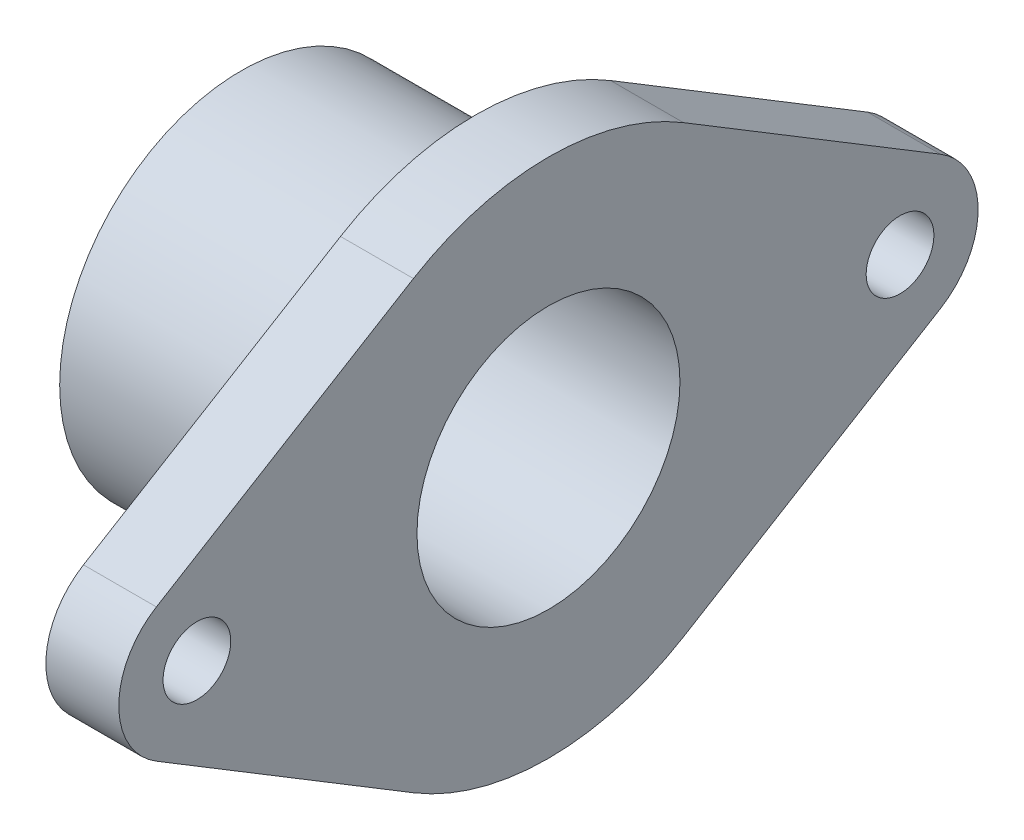
ISO-10303-21;
HEADER;
FILE_DESCRIPTION(('STEP AP214'),'2;1');
FILE_NAME('part.step','',(''),(''),'','','');
FILE_SCHEMA(('AUTOMOTIVE_DESIGN { 1 0 10303 214 1 1 1 1 }'));
ENDSEC;
DATA;
#1=APPLICATION_CONTEXT('core data for automotive mechanical design processes');
#2=APPLICATION_PROTOCOL_DEFINITION('international standard','automotive_design',2000,#1);
#3=PRODUCT_CONTEXT('',#1,'mechanical');
#4=PRODUCT('Part','Part','',(#3));
#5=PRODUCT_RELATED_PRODUCT_CATEGORY('part','',(#4));
#6=PRODUCT_DEFINITION_FORMATION('','',#4);
#7=PRODUCT_DEFINITION_CONTEXT('part definition',#1,'design');
#8=PRODUCT_DEFINITION('design','',#6,#7);
#9=PRODUCT_DEFINITION_SHAPE('','',#8);
#10=(LENGTH_UNIT() NAMED_UNIT(*) SI_UNIT(.MILLI.,.METRE.));
#11=(NAMED_UNIT(*) PLANE_ANGLE_UNIT() SI_UNIT($,.RADIAN.));
#12=(NAMED_UNIT(*) SI_UNIT($,.STERADIAN.) SOLID_ANGLE_UNIT());
#13=UNCERTAINTY_MEASURE_WITH_UNIT(LENGTH_MEASURE(1.E-05),#10,'distance_accuracy_value','');
#14=(GEOMETRIC_REPRESENTATION_CONTEXT(3) GLOBAL_UNCERTAINTY_ASSIGNED_CONTEXT((#13)) GLOBAL_UNIT_ASSIGNED_CONTEXT((#10,
#11,#12)) REPRESENTATION_CONTEXT('',''));
#15=CARTESIAN_POINT('',(0.,0.,0.));
#16=DIRECTION('',(0.,0.,1.));
#17=DIRECTION('',(1.,0.,0.));
#18=AXIS2_PLACEMENT_3D('',#15,#16,#17);
#19=CARTESIAN_POINT('',(0.,0.,0.));
#20=DIRECTION('',(1.,0.,0.));
#21=DIRECTION('',(0.,0.,-0.999999999999998));
#22=AXIS2_PLACEMENT_3D('',#19,#20,#21);
#23=PLANE('',#22);
#24=CARTESIAN_POINT('',(0.,0.,0.));
#25=DIRECTION('',(1.,0.,0.));
#26=DIRECTION('',(0.,0.,-0.999999999999998));
#27=AXIS2_PLACEMENT_3D('',#24,#25,#26);
#28=CIRCLE('',#27,41.85);
#29=CARTESIAN_POINT('',(0.,0.,-41.8499999999999));
#30=VERTEX_POINT('',#29);
#31=EDGE_CURVE('E202',#30,#30,#28,.T.);
#32=ORIENTED_EDGE('',*,*,#31,.T.);
#33=EDGE_LOOP('',(#32));
#34=FACE_BOUND('',#33,.T.);
#35=CARTESIAN_POINT('',(0.,0.,0.));
#36=DIRECTION('',(1.,0.,0.));
#37=DIRECTION('',(0.,0.,-0.999999999999998));
#38=AXIS2_PLACEMENT_3D('',#35,#36,#37);
#39=CIRCLE('',#38,50.);
#40=CARTESIAN_POINT('',(0.,42.7533199282042,-25.9259259259221));
#41=VERTEX_POINT('',#40);
#42=CARTESIAN_POINT('',(0.,42.753319928206,25.9259259259297));
#43=VERTEX_POINT('',#42);
#44=EDGE_CURVE('E131',#41,#43,#39,.T.);
#45=ORIENTED_EDGE('',*,*,#44,.F.);
#46=DIRECTION('',(0.,0.518518518518521,0.855066398564088));
#47=VECTOR('',#46,1.);
#48=CARTESIAN_POINT('',(0.,42.7533199282042,-25.9259259259221));
#49=LINE('',#48,#47);
#50=CARTESIAN_POINT('',(4.44089209850063E-13,12.8259959784613,-75.277777777774));
#51=VERTEX_POINT('',#50);
#52=EDGE_CURVE('E86',#51,#41,#49,.T.);
#53=ORIENTED_EDGE('',*,*,#52,.F.);
#54=CARTESIAN_POINT('',(4.44089209850063E-13,-3.5527136788005E-12,-67.4999999999963));
#55=DIRECTION('',(1.,0.,0.));
#56=DIRECTION('',(0.,0.,-0.999999999999998));
#57=AXIS2_PLACEMENT_3D('',#54,#55,#56);
#58=CIRCLE('',#57,15.);
#59=CARTESIAN_POINT('',(-4.44089209850063E-13,-12.8259959784631,-75.2777777777793));
#60=VERTEX_POINT('',#59);
#61=EDGE_CURVE('E80',#60,#51,#58,.T.);
#62=ORIENTED_EDGE('',*,*,#61,.F.);
#63=DIRECTION('',(0.,0.518518518518519,-0.855066398564086));
#64=VECTOR('',#63,1.);
#65=CARTESIAN_POINT('',(-4.44089209850063E-13,-12.8259959784631,-75.2777777777793));
#66=LINE('',#65,#64);
#67=CARTESIAN_POINT('',(0.,-42.7533199282042,-25.9259259259261));
#68=VERTEX_POINT('',#67);
#69=EDGE_CURVE('E121',#68,#60,#66,.T.);
#70=ORIENTED_EDGE('',*,*,#69,.F.);
#71=CARTESIAN_POINT('',(0.,0.,0.));
#72=DIRECTION('',(1.,0.,0.));
#73=DIRECTION('',(0.,0.,-0.999999999999998));
#74=AXIS2_PLACEMENT_3D('',#71,#72,#73);
#75=CIRCLE('',#74,50.);
#76=CARTESIAN_POINT('',(0.,-42.7533199282042,25.9259259259257));
#77=VERTEX_POINT('',#76);
#78=EDGE_CURVE('E141',#77,#68,#75,.T.);
#79=ORIENTED_EDGE('',*,*,#78,.F.);
#80=DIRECTION('',(0.,-0.518518518518521,-0.855066398564087));
#81=VECTOR('',#80,1.);
#82=CARTESIAN_POINT('',(0.,-12.8259959784578,75.2777777777793));
#83=LINE('',#82,#81);
#84=CARTESIAN_POINT('',(0.,-12.8259959784578,75.2777777777793));
#85=VERTEX_POINT('',#84);
#86=EDGE_CURVE('E139',#85,#77,#83,.T.);
#87=ORIENTED_EDGE('',*,*,#86,.F.);
#88=CARTESIAN_POINT('',(0.,1.77635683940025E-12,67.4999999999999));
#89=DIRECTION('',(1.,0.,0.));
#90=DIRECTION('',(0.,0.,-0.999999999999998));
#91=AXIS2_PLACEMENT_3D('',#88,#89,#90);
#92=CIRCLE('',#91,15.);
#93=CARTESIAN_POINT('',(8.88178419700125E-13,12.8259959784613,75.2777777777829));
#94=VERTEX_POINT('',#93);
#95=EDGE_CURVE('E137',#94,#85,#92,.T.);
#96=ORIENTED_EDGE('',*,*,#95,.F.);
#97=DIRECTION('',(0.,-0.518518518518519,0.855066398564086));
#98=VECTOR('',#97,1.);
#99=CARTESIAN_POINT('',(0.,42.753319928206,25.9259259259297));
#100=LINE('',#99,#98);
#101=EDGE_CURVE('E134',#43,#94,#100,.T.);
#102=ORIENTED_EDGE('',*,*,#101,.F.);
#103=EDGE_LOOP('',(#45,#53,#62,#70,#79,#87,#96,#102));
#104=FACE_BOUND('',#103,.T.);
#105=CARTESIAN_POINT('',(0.,1.77635683940025E-12,67.4999999999999));
#106=DIRECTION('',(-1.,0.,0.));
#107=DIRECTION('',(0.,0.,0.999999999999998));
#108=AXIS2_PLACEMENT_3D('',#105,#106,#107);
#109=CIRCLE('',#108,6.5);
#110=CARTESIAN_POINT('',(0.,1.78474596213007E-12,73.9999999999999));
#111=VERTEX_POINT('',#110);
#112=EDGE_CURVE('E179',#111,#111,#109,.T.);
#113=ORIENTED_EDGE('',*,*,#112,.F.);
#114=EDGE_LOOP('',(#113));
#115=FACE_BOUND('',#114,.T.);
#116=CARTESIAN_POINT('',(4.44089209850063E-13,-3.5527136788005E-12,-67.4999999999963));
#117=DIRECTION('',(-1.,0.,0.));
#118=DIRECTION('',(0.,0.,0.999999999999998));
#119=AXIS2_PLACEMENT_3D('',#116,#117,#118);
#120=CIRCLE('',#119,6.5);
#121=CARTESIAN_POINT('',(4.44122441969167E-13,-3.54432455607068E-12,-60.9999999999963));
#122=VERTEX_POINT('',#121);
#123=EDGE_CURVE('E185',#122,#122,#120,.T.);
#124=ORIENTED_EDGE('',*,*,#123,.F.);
#125=EDGE_LOOP('',(#124));
#126=FACE_BOUND('',#125,.T.);
#127=ADVANCED_FACE('F34',(#34,#104,#115,#126),#23,.F.);
#128=CARTESIAN_POINT('',(14.,0.,0.));
#129=DIRECTION('',(-1.,0.,0.));
#130=DIRECTION('',(0.,0.,0.999999999999998));
#131=AXIS2_PLACEMENT_3D('',#128,#129,#130);
#132=CYLINDRICAL_SURFACE('',#131,50.);
#133=ORIENTED_EDGE('',*,*,#44,.T.);
#134=DIRECTION('',(-1.,0.,0.));
#135=VECTOR('',#134,1.);
#136=CARTESIAN_POINT('',(14.,42.7533199282042,25.9259259259297));
#137=LINE('',#136,#135);
#138=CARTESIAN_POINT('',(14.,42.7533199282042,25.9259259259297));
#139=VERTEX_POINT('',#138);
#140=EDGE_CURVE('E11',#139,#43,#137,.T.);
#141=ORIENTED_EDGE('',*,*,#140,.F.);
#142=CARTESIAN_POINT('',(14.,0.,0.));
#143=DIRECTION('',(1.,0.,0.));
#144=DIRECTION('',(0.,0.,-0.999999999999998));
#145=AXIS2_PLACEMENT_3D('',#142,#143,#144);
#146=CIRCLE('',#145,50.);
#147=CARTESIAN_POINT('',(14.,42.7533199282042,-25.9259259259221));
#148=VERTEX_POINT('',#147);
#149=EDGE_CURVE('E146',#148,#139,#146,.T.);
#150=ORIENTED_EDGE('',*,*,#149,.F.);
#151=DIRECTION('',(-1.,0.,0.));
#152=VECTOR('',#151,1.);
#153=CARTESIAN_POINT('',(14.,42.7533199282042,-25.9259259259221));
#154=LINE('',#153,#152);
#155=EDGE_CURVE('E127',#148,#41,#154,.T.);
#156=ORIENTED_EDGE('',*,*,#155,.T.);
#157=EDGE_LOOP('',(#133,#141,#150,#156));
#158=FACE_BOUND('',#157,.T.);
#159=ADVANCED_FACE('F36',(#158),#132,.T.);
#160=CARTESIAN_POINT('',(14.,42.7533199282042,25.9259259259297));
#161=DIRECTION('',(0.,-0.855066398564092,-0.518518518518519));
#162=DIRECTION('',(0.,0.518518518518519,-0.855066398564086));
#163=AXIS2_PLACEMENT_3D('',#160,#161,#162);
#164=PLANE('',#163);
#165=ORIENTED_EDGE('',*,*,#101,.T.);
#166=DIRECTION('',(-1.,0.,0.));
#167=VECTOR('',#166,1.);
#168=CARTESIAN_POINT('',(14.0000000000009,12.8259959784613,75.2777777777829));
#169=LINE('',#168,#167);
#170=CARTESIAN_POINT('',(14.0000000000009,12.8259959784613,75.2777777777829));
#171=VERTEX_POINT('',#170);
#172=EDGE_CURVE('E43',#171,#94,#169,.T.);
#173=ORIENTED_EDGE('',*,*,#172,.F.);
#174=DIRECTION('',(0.,-0.518518518518519,0.855066398564086));
#175=VECTOR('',#174,1.);
#176=CARTESIAN_POINT('',(14.,42.7533199282042,25.9259259259297));
#177=LINE('',#176,#175);
#178=EDGE_CURVE('E94',#139,#171,#177,.T.);
#179=ORIENTED_EDGE('',*,*,#178,.F.);
#180=ORIENTED_EDGE('',*,*,#140,.T.);
#181=EDGE_LOOP('',(#165,#173,#179,#180));
#182=FACE_BOUND('',#181,.T.);
#183=ADVANCED_FACE('F224',(#182),#164,.F.);
#184=CARTESIAN_POINT('',(14.,1.77635683940025E-12,67.4999999999999));
#185=DIRECTION('',(-1.,0.,0.));
#186=DIRECTION('',(0.,0.,0.999999999999998));
#187=AXIS2_PLACEMENT_3D('',#184,#185,#186);
#188=CYLINDRICAL_SURFACE('',#187,15.);
#189=ORIENTED_EDGE('',*,*,#95,.T.);
#190=DIRECTION('',(-1.,0.,0.));
#191=VECTOR('',#190,1.);
#192=CARTESIAN_POINT('',(14.,-12.8259959784578,75.2777777777793));
#193=LINE('',#192,#191);
#194=CARTESIAN_POINT('',(14.,-12.8259959784578,75.2777777777793));
#195=VERTEX_POINT('',#194);
#196=EDGE_CURVE('E153',#195,#85,#193,.T.);
#197=ORIENTED_EDGE('',*,*,#196,.F.);
#198=CARTESIAN_POINT('',(14.,1.77635683940025E-12,67.4999999999999));
#199=DIRECTION('',(1.,0.,0.));
#200=DIRECTION('',(0.,0.,-0.999999999999998));
#201=AXIS2_PLACEMENT_3D('',#198,#199,#200);
#202=CIRCLE('',#201,15.);
#203=EDGE_CURVE('E161',#171,#195,#202,.T.);
#204=ORIENTED_EDGE('',*,*,#203,.F.);
#205=ORIENTED_EDGE('',*,*,#172,.T.);
#206=EDGE_LOOP('',(#189,#197,#204,#205));
#207=FACE_BOUND('',#206,.T.);
#208=ADVANCED_FACE('F159',(#207),#188,.T.);
#209=CARTESIAN_POINT('',(14.,-12.8259959784578,75.2777777777793));
#210=DIRECTION('',(0.,0.855066398564091,-0.518518518518516));
#211=DIRECTION('',(0.,0.518518518518521,0.855066398564088));
#212=AXIS2_PLACEMENT_3D('',#209,#210,#211);
#213=PLANE('',#212);
#214=ORIENTED_EDGE('',*,*,#86,.T.);
#215=DIRECTION('',(-1.,0.,0.));
#216=VECTOR('',#215,1.);
#217=CARTESIAN_POINT('',(14.,-42.753319928206,25.9259259259257));
#218=LINE('',#217,#216);
#219=CARTESIAN_POINT('',(14.,-42.753319928206,25.9259259259257));
#220=VERTEX_POINT('',#219);
#221=EDGE_CURVE('E150',#220,#77,#218,.T.);
#222=ORIENTED_EDGE('',*,*,#221,.F.);
#223=DIRECTION('',(0.,-0.518518518518521,-0.855066398564087));
#224=VECTOR('',#223,1.);
#225=CARTESIAN_POINT('',(14.,-12.8259959784578,75.2777777777793));
#226=LINE('',#225,#224);
#227=EDGE_CURVE('E173',#195,#220,#226,.T.);
#228=ORIENTED_EDGE('',*,*,#227,.F.);
#229=ORIENTED_EDGE('',*,*,#196,.T.);
#230=EDGE_LOOP('',(#214,#222,#228,#229));
#231=FACE_BOUND('',#230,.T.);
#232=ADVANCED_FACE('F169',(#231),#213,.F.);
#233=CARTESIAN_POINT('',(14.,0.,0.));
#234=DIRECTION('',(-1.,0.,0.));
#235=DIRECTION('',(0.,0.,0.999999999999998));
#236=AXIS2_PLACEMENT_3D('',#233,#234,#235);
#237=CYLINDRICAL_SURFACE('',#236,50.);
#238=ORIENTED_EDGE('',*,*,#78,.T.);
#239=DIRECTION('',(-1.,0.,0.));
#240=VECTOR('',#239,1.);
#241=CARTESIAN_POINT('',(14.,-42.7533199282042,-25.9259259259261));
#242=LINE('',#241,#240);
#243=CARTESIAN_POINT('',(14.,-42.7533199282042,-25.9259259259261));
#244=VERTEX_POINT('',#243);
#245=EDGE_CURVE('E122',#244,#68,#242,.T.);
#246=ORIENTED_EDGE('',*,*,#245,.F.);
#247=CARTESIAN_POINT('',(14.,0.,0.));
#248=DIRECTION('',(1.,0.,0.));
#249=DIRECTION('',(0.,0.,-0.999999999999998));
#250=AXIS2_PLACEMENT_3D('',#247,#248,#249);
#251=CIRCLE('',#250,50.);
#252=EDGE_CURVE('E113',#220,#244,#251,.T.);
#253=ORIENTED_EDGE('',*,*,#252,.F.);
#254=ORIENTED_EDGE('',*,*,#221,.T.);
#255=EDGE_LOOP('',(#238,#246,#253,#254));
#256=FACE_BOUND('',#255,.T.);
#257=ADVANCED_FACE('F172',(#256),#237,.T.);
#258=CARTESIAN_POINT('',(13.9999999999996,-12.8259959784613,-75.2777777777793));
#259=DIRECTION('',(0.,0.855066398564092,0.518518518518519));
#260=DIRECTION('',(0.,-0.518518518518519,0.855066398564086));
#261=AXIS2_PLACEMENT_3D('',#258,#259,#260);
#262=PLANE('',#261);
#263=ORIENTED_EDGE('',*,*,#69,.T.);
#264=DIRECTION('',(-1.,0.,0.));
#265=VECTOR('',#264,1.);
#266=CARTESIAN_POINT('',(13.9999999999996,-12.8259959784613,-75.2777777777793));
#267=LINE('',#266,#265);
#268=CARTESIAN_POINT('',(13.9999999999996,-12.8259959784613,-75.2777777777793));
#269=VERTEX_POINT('',#268);
#270=EDGE_CURVE('E118',#269,#60,#267,.T.);
#271=ORIENTED_EDGE('',*,*,#270,.F.);
#272=DIRECTION('',(0.,0.518518518518519,-0.855066398564086));
#273=VECTOR('',#272,1.);
#274=CARTESIAN_POINT('',(13.9999999999996,-12.8259959784613,-75.2777777777793));
#275=LINE('',#274,#273);
#276=EDGE_CURVE('E107',#244,#269,#275,.T.);
#277=ORIENTED_EDGE('',*,*,#276,.F.);
#278=ORIENTED_EDGE('',*,*,#245,.T.);
#279=EDGE_LOOP('',(#263,#271,#277,#278));
#280=FACE_BOUND('',#279,.T.);
#281=ADVANCED_FACE('F119',(#280),#262,.F.);
#282=CARTESIAN_POINT('',(14.0000000000005,0.,-67.4999999999963));
#283=DIRECTION('',(-1.,0.,0.));
#284=DIRECTION('',(0.,0.,0.999999999999998));
#285=AXIS2_PLACEMENT_3D('',#282,#283,#284);
#286=CYLINDRICAL_SURFACE('',#285,15.);
#287=ORIENTED_EDGE('',*,*,#61,.T.);
#288=DIRECTION('',(-1.,0.,0.));
#289=VECTOR('',#288,1.);
#290=CARTESIAN_POINT('',(14.0000000000005,12.8259959784631,-75.277777777774));
#291=LINE('',#290,#289);
#292=CARTESIAN_POINT('',(14.0000000000005,12.8259959784631,-75.277777777774));
#293=VERTEX_POINT('',#292);
#294=EDGE_CURVE('E123',#293,#51,#291,.T.);
#295=ORIENTED_EDGE('',*,*,#294,.F.);
#296=CARTESIAN_POINT('',(14.0000000000005,0.,-67.4999999999963));
#297=DIRECTION('',(1.,0.,0.));
#298=DIRECTION('',(0.,0.,-0.999999999999998));
#299=AXIS2_PLACEMENT_3D('',#296,#297,#298);
#300=CIRCLE('',#299,15.);
#301=EDGE_CURVE('E111',#269,#293,#300,.T.);
#302=ORIENTED_EDGE('',*,*,#301,.F.);
#303=ORIENTED_EDGE('',*,*,#270,.T.);
#304=EDGE_LOOP('',(#287,#295,#302,#303));
#305=FACE_BOUND('',#304,.T.);
#306=ADVANCED_FACE('F125',(#305),#286,.T.);
#307=CARTESIAN_POINT('',(14.,42.7533199282042,-25.9259259259221));
#308=DIRECTION('',(0.,-0.855066398564091,0.518518518518515));
#309=DIRECTION('',(0.,-0.518518518518521,-0.855066398564088));
#310=AXIS2_PLACEMENT_3D('',#307,#308,#309);
#311=PLANE('',#310);
#312=ORIENTED_EDGE('',*,*,#52,.T.);
#313=ORIENTED_EDGE('',*,*,#155,.F.);
#314=DIRECTION('',(0.,0.518518518518521,0.855066398564088));
#315=VECTOR('',#314,1.);
#316=CARTESIAN_POINT('',(14.,42.7533199282042,-25.9259259259221));
#317=LINE('',#316,#315);
#318=EDGE_CURVE('E51',#293,#148,#317,.T.);
#319=ORIENTED_EDGE('',*,*,#318,.F.);
#320=ORIENTED_EDGE('',*,*,#294,.T.);
#321=EDGE_LOOP('',(#312,#313,#319,#320));
#322=FACE_BOUND('',#321,.T.);
#323=ADVANCED_FACE('F229',(#322),#311,.F.);
#324=CARTESIAN_POINT('',(14.,0.,0.));
#325=DIRECTION('',(1.,0.,0.));
#326=DIRECTION('',(0.,0.,-0.999999999999998));
#327=AXIS2_PLACEMENT_3D('',#324,#325,#326);
#328=PLANE('',#327);
#329=CARTESIAN_POINT('',(14.,0.,0.));
#330=DIRECTION('',(-1.,0.,0.));
#331=DIRECTION('',(0.,0.,0.999999999999998));
#332=AXIS2_PLACEMENT_3D('',#329,#330,#331);
#333=CIRCLE('',#332,25.25);
#334=CARTESIAN_POINT('',(14.,0.,25.25));
#335=VERTEX_POINT('',#334);
#336=EDGE_CURVE('E188',#335,#335,#333,.T.);
#337=ORIENTED_EDGE('',*,*,#336,.T.);
#338=EDGE_LOOP('',(#337));
#339=FACE_BOUND('',#338,.T.);
#340=CARTESIAN_POINT('',(14.0000000000005,0.,-67.4999999999963));
#341=DIRECTION('',(-1.,0.,0.));
#342=DIRECTION('',(0.,0.,0.999999999999998));
#343=AXIS2_PLACEMENT_3D('',#340,#341,#342);
#344=CIRCLE('',#343,6.5);
#345=CARTESIAN_POINT('',(14.0000000000005,0.,-60.9999999999963));
#346=VERTEX_POINT('',#345);
#347=EDGE_CURVE('E182',#346,#346,#344,.T.);
#348=ORIENTED_EDGE('',*,*,#347,.T.);
#349=EDGE_LOOP('',(#348));
#350=FACE_BOUND('',#349,.T.);
#351=CARTESIAN_POINT('',(14.,1.77635683940025E-12,67.4999999999999));
#352=DIRECTION('',(-1.,0.,0.));
#353=DIRECTION('',(0.,0.,0.999999999999998));
#354=AXIS2_PLACEMENT_3D('',#351,#352,#353);
#355=CIRCLE('',#354,6.5);
#356=CARTESIAN_POINT('',(14.,1.78474596213007E-12,73.9999999999999));
#357=VERTEX_POINT('',#356);
#358=EDGE_CURVE('E135',#357,#357,#355,.T.);
#359=ORIENTED_EDGE('',*,*,#358,.T.);
#360=EDGE_LOOP('',(#359));
#361=FACE_BOUND('',#360,.T.);
#362=ORIENTED_EDGE('',*,*,#149,.T.);
#363=ORIENTED_EDGE('',*,*,#178,.T.);
#364=ORIENTED_EDGE('',*,*,#203,.T.);
#365=ORIENTED_EDGE('',*,*,#227,.T.);
#366=ORIENTED_EDGE('',*,*,#252,.T.);
#367=ORIENTED_EDGE('',*,*,#276,.T.);
#368=ORIENTED_EDGE('',*,*,#301,.T.);
#369=ORIENTED_EDGE('',*,*,#318,.T.);
#370=EDGE_LOOP('',(#362,#363,#364,#365,#366,#367,#368,#369));
#371=FACE_BOUND('',#370,.T.);
#372=ADVANCED_FACE('F109',(#339,#350,#361,#371),#328,.T.);
#373=CARTESIAN_POINT('',(14.,1.77635683940025E-12,67.4999999999999));
#374=DIRECTION('',(-1.,0.,0.));
#375=DIRECTION('',(0.,0.,0.999999999999998));
#376=AXIS2_PLACEMENT_3D('',#373,#374,#375);
#377=CYLINDRICAL_SURFACE('',#376,6.5);
#378=ORIENTED_EDGE('',*,*,#358,.F.);
#379=EDGE_LOOP('',(#378));
#380=FACE_BOUND('',#379,.T.);
#381=ORIENTED_EDGE('',*,*,#112,.T.);
#382=EDGE_LOOP('',(#381));
#383=FACE_BOUND('',#382,.T.);
#384=ADVANCED_FACE('F278',(#380,#383),#377,.F.);
#385=CARTESIAN_POINT('',(14.0000000000005,0.,-67.4999999999963));
#386=DIRECTION('',(-1.,0.,0.));
#387=DIRECTION('',(0.,0.,0.999999999999998));
#388=AXIS2_PLACEMENT_3D('',#385,#386,#387);
#389=CYLINDRICAL_SURFACE('',#388,6.5);
#390=ORIENTED_EDGE('',*,*,#347,.F.);
#391=EDGE_LOOP('',(#390));
#392=FACE_BOUND('',#391,.T.);
#393=ORIENTED_EDGE('',*,*,#123,.T.);
#394=EDGE_LOOP('',(#393));
#395=FACE_BOUND('',#394,.T.);
#396=ADVANCED_FACE('F285',(#392,#395),#389,.F.);
#397=CARTESIAN_POINT('',(14.,0.,0.));
#398=DIRECTION('',(-1.,0.,0.));
#399=DIRECTION('',(0.,0.,0.999999999999998));
#400=AXIS2_PLACEMENT_3D('',#397,#398,#399);
#401=CYLINDRICAL_SURFACE('',#400,25.25);
#402=ORIENTED_EDGE('',*,*,#336,.F.);
#403=EDGE_LOOP('',(#402));
#404=FACE_BOUND('',#403,.T.);
#405=CARTESIAN_POINT('',(-45.,-1.77635683940025E-12,0.));
#406=DIRECTION('',(-1.,0.,0.));
#407=DIRECTION('',(0.,0.,0.999999999999998));
#408=AXIS2_PLACEMENT_3D('',#405,#406,#407);
#409=CIRCLE('',#408,25.25);
#410=CARTESIAN_POINT('',(-45.,-1.74376832418055E-12,25.25));
#411=VERTEX_POINT('',#410);
#412=EDGE_CURVE('E196',#411,#411,#409,.T.);
#413=ORIENTED_EDGE('',*,*,#412,.T.);
#414=EDGE_LOOP('',(#413));
#415=FACE_BOUND('',#414,.T.);
#416=ADVANCED_FACE('F292',(#404,#415),#401,.F.);
#417=CARTESIAN_POINT('',(-45.,-1.77635683940025E-12,0.));
#418=DIRECTION('',(-1.,0.,0.));
#419=DIRECTION('',(0.,0.,0.999999999999998));
#420=AXIS2_PLACEMENT_3D('',#417,#418,#419);
#421=PLANE('',#420);
#422=CARTESIAN_POINT('',(-45.,-1.77635683940025E-12,0.));
#423=DIRECTION('',(-1.,0.,0.));
#424=DIRECTION('',(0.,0.,0.999999999999998));
#425=AXIS2_PLACEMENT_3D('',#422,#423,#424);
#426=CIRCLE('',#425,34.85);
#427=CARTESIAN_POINT('',(-45.,-1.82133544357477E-12,-34.8499999999999));
#428=VERTEX_POINT('',#427);
#429=EDGE_CURVE('E193',#428,#428,#426,.T.);
#430=ORIENTED_EDGE('',*,*,#429,.T.);
#431=EDGE_LOOP('',(#430));
#432=FACE_BOUND('',#431,.T.);
#433=ORIENTED_EDGE('',*,*,#412,.F.);
#434=EDGE_LOOP('',(#433));
#435=FACE_BOUND('',#434,.T.);
#436=ADVANCED_FACE('F215',(#432,#435),#421,.T.);
#437=CARTESIAN_POINT('',(-45.,-1.77635683940025E-12,0.));
#438=DIRECTION('',(1.,0.,0.));
#439=DIRECTION('',(0.,0.,-0.999999999999998));
#440=AXIS2_PLACEMENT_3D('',#437,#438,#439);
#441=CYLINDRICAL_SURFACE('',#440,34.85);
#442=CARTESIAN_POINT('',(-5.,0.,0.));
#443=DIRECTION('',(1.,0.,0.));
#444=DIRECTION('',(0.,0.,-0.999999999999998));
#445=AXIS2_PLACEMENT_3D('',#442,#443,#444);
#446=CIRCLE('',#445,34.85);
#447=CARTESIAN_POINT('',(-5.,-1.82799185066394E-12,-34.8499999999999));
#448=VERTEX_POINT('',#447);
#449=EDGE_CURVE('E199',#448,#448,#446,.T.);
#450=CARTESIAN_POINT('',(-5.,-1.82799185066394E-12,-34.8499999999999));
#451=CARTESIAN_POINT('',(-5.41666666666666,-1.82792251309009E-12,-34.8499999999999));
#452=CARTESIAN_POINT('',(-5.83333333333333,-1.82785317551625E-12,-34.8499999999999));
#453=CARTESIAN_POINT('',(-6.66666666666667,-1.82771450036856E-12,-34.8499999999999));
#454=CARTESIAN_POINT('',(-7.08333333333333,-1.82764516279471E-12,-34.8499999999999));
#455=CARTESIAN_POINT('',(-7.91666666666667,-1.82750648764702E-12,-34.8499999999999));
#456=CARTESIAN_POINT('',(-8.33333333333333,-1.82743715007317E-12,-34.8499999999999));
#457=CARTESIAN_POINT('',(-9.16666666666667,-1.82729847492548E-12,-34.8499999999999));
#458=CARTESIAN_POINT('',(-9.58333333333333,-1.82722913735164E-12,-34.8499999999999));
#459=CARTESIAN_POINT('',(-10.4166666666667,-1.82709046220395E-12,-34.8499999999999));
#460=CARTESIAN_POINT('',(-10.8333333333333,-1.8270211246301E-12,-34.8499999999999));
#461=CARTESIAN_POINT('',(-11.6666666666667,-1.82688244948241E-12,-34.8499999999999));
#462=CARTESIAN_POINT('',(-12.0833333333333,-1.82681311190856E-12,-34.8499999999999));
#463=CARTESIAN_POINT('',(-12.9166666666667,-1.82667443676087E-12,-34.8499999999999));
#464=CARTESIAN_POINT('',(-13.3333333333333,-1.82660509918703E-12,-34.8499999999999));
#465=CARTESIAN_POINT('',(-14.1666666666667,-1.82646642403934E-12,-34.8499999999999));
#466=CARTESIAN_POINT('',(-14.5833333333333,-1.82639708646549E-12,-34.8499999999999));
#467=CARTESIAN_POINT('',(-15.4166666666667,-1.8262584113178E-12,-34.8499999999999));
#468=CARTESIAN_POINT('',(-15.8333333333333,-1.82618907374395E-12,-34.8499999999999));
#469=CARTESIAN_POINT('',(-16.6666666666667,-1.82605039859626E-12,-34.8499999999999));
#470=CARTESIAN_POINT('',(-17.0833333333333,-1.82598106102242E-12,-34.8499999999999));
#471=CARTESIAN_POINT('',(-17.9166666666667,-1.82584238587473E-12,-34.8499999999999));
#472=CARTESIAN_POINT('',(-18.3333333333333,-1.82577304830088E-12,-34.8499999999999));
#473=CARTESIAN_POINT('',(-19.1666666666667,-1.82563437315319E-12,-34.8499999999999));
#474=CARTESIAN_POINT('',(-19.5833333333333,-1.82556503557934E-12,-34.8499999999999));
#475=CARTESIAN_POINT('',(-20.4166666666667,-1.82542636043165E-12,-34.8499999999999));
#476=CARTESIAN_POINT('',(-20.8333333333333,-1.82535702285781E-12,-34.8499999999999));
#477=CARTESIAN_POINT('',(-21.6666666666667,-1.82521834771012E-12,-34.8499999999999));
#478=CARTESIAN_POINT('',(-22.0833333333333,-1.82514901013627E-12,-34.8499999999999));
#479=CARTESIAN_POINT('',(-22.9166666666667,-1.82501033498858E-12,-34.8499999999999));
#480=CARTESIAN_POINT('',(-23.3333333333334,-1.82494099741473E-12,-34.8499999999999));
#481=CARTESIAN_POINT('',(-24.1666666666667,-1.82480232226704E-12,-34.8499999999999));
#482=CARTESIAN_POINT('',(-24.5833333333334,-1.8247329846932E-12,-34.8499999999999));
#483=CARTESIAN_POINT('',(-25.4166666666667,-1.82459430954551E-12,-34.8499999999999));
#484=CARTESIAN_POINT('',(-25.8333333333334,-1.82452497197166E-12,-34.8499999999999));
#485=CARTESIAN_POINT('',(-26.6666666666667,-1.82438629682397E-12,-34.8499999999999));
#486=CARTESIAN_POINT('',(-27.0833333333334,-1.82431695925013E-12,-34.8499999999999));
#487=CARTESIAN_POINT('',(-27.9166666666667,-1.82417828410243E-12,-34.8499999999999));
#488=CARTESIAN_POINT('',(-28.3333333333334,-1.82410894652859E-12,-34.8499999999999));
#489=CARTESIAN_POINT('',(-29.1666666666667,-1.8239702713809E-12,-34.8499999999999));
#490=CARTESIAN_POINT('',(-29.5833333333334,-1.82390093380705E-12,-34.8499999999999));
#491=CARTESIAN_POINT('',(-30.4166666666667,-1.82376225865936E-12,-34.8499999999999));
#492=CARTESIAN_POINT('',(-30.8333333333334,-1.82369292108552E-12,-34.8499999999999));
#493=CARTESIAN_POINT('',(-31.6666666666667,-1.82355424593782E-12,-34.8499999999999));
#494=CARTESIAN_POINT('',(-32.0833333333334,-1.82348490836398E-12,-34.8499999999999));
#495=CARTESIAN_POINT('',(-32.9166666666667,-1.82334623321629E-12,-34.8499999999999));
#496=CARTESIAN_POINT('',(-33.3333333333334,-1.82327689564244E-12,-34.8499999999999));
#497=CARTESIAN_POINT('',(-34.1666666666667,-1.82313822049475E-12,-34.8499999999999));
#498=CARTESIAN_POINT('',(-34.5833333333334,-1.82306888292091E-12,-34.8499999999999));
#499=CARTESIAN_POINT('',(-35.4166666666667,-1.82293020777321E-12,-34.8499999999999));
#500=CARTESIAN_POINT('',(-35.8333333333334,-1.82286087019937E-12,-34.8499999999999));
#501=CARTESIAN_POINT('',(-36.6666666666667,-1.82272219505168E-12,-34.8499999999999));
#502=CARTESIAN_POINT('',(-37.0833333333334,-1.82265285747783E-12,-34.8499999999999));
#503=CARTESIAN_POINT('',(-37.9166666666667,-1.82251418233014E-12,-34.8499999999999));
#504=CARTESIAN_POINT('',(-38.3333333333334,-1.8224448447563E-12,-34.8499999999999));
#505=CARTESIAN_POINT('',(-39.1666666666667,-1.82230616960861E-12,-34.8499999999999));
#506=CARTESIAN_POINT('',(-39.5833333333334,-1.82223683203476E-12,-34.8499999999999));
#507=CARTESIAN_POINT('',(-40.4166666666667,-1.82209815688707E-12,-34.8499999999999));
#508=CARTESIAN_POINT('',(-40.8333333333334,-1.82202881931322E-12,-34.8499999999999));
#509=CARTESIAN_POINT('',(-41.6666666666667,-1.82189014416553E-12,-34.8499999999999));
#510=CARTESIAN_POINT('',(-42.0833333333334,-1.82182080659169E-12,-34.8499999999999));
#511=CARTESIAN_POINT('',(-42.9166666666667,-1.821682131444E-12,-34.8499999999999));
#512=CARTESIAN_POINT('',(-43.3333333333334,-1.82161279387015E-12,-34.8499999999999));
#513=CARTESIAN_POINT('',(-44.1666666666667,-1.82147411872246E-12,-34.8499999999999));
#514=CARTESIAN_POINT('',(-44.5833333333334,-1.82140478114861E-12,-34.8499999999999));
#515=CARTESIAN_POINT('',(-45.,-1.82133544357477E-12,-34.8499999999999));
#516=B_SPLINE_CURVE_WITH_KNOTS('',3,(#450,#451,#452,#453,#454,#455,#456,#457,#458,#459,#460,
#461,#462,#463,#464,#465,#466,#467,#468,#469,#470,#471,#472,#473,#474,#475,#476,#477,#478,#479,
#480,#481,#482,#483,#484,#485,#486,#487,#488,#489,#490,#491,#492,#493,#494,#495,#496,#497,#498,
#499,#500,#501,#502,#503,#504,#505,#506,#507,#508,#509,#510,#511,#512,#513,#514,#515),
.UNSPECIFIED.,.F.,.F.,(4,2,2,2,2,2,2,2,2,2,2,2,2,2,2,2,2,2,2,2,2,2,2,2,2,2,2,2,2,2,2,2,4),(0.,
1.25,2.5,3.75,5.,6.25000000000001,7.50000000000001,8.75000000000001,10.,11.25,12.5,13.75,15.,
16.25,17.5,18.75,20.,21.25,22.5,23.75,25.,26.25,27.5,28.75,30.,31.25,32.5,33.75,35.,36.25,37.5,
38.75,40.),.UNSPECIFIED.);
#517=EDGE_CURVE('BSEAM209',#448,#428,#516,.T.);
#518=ORIENTED_EDGE('',*,*,#449,.F.);
#519=ORIENTED_EDGE('',*,*,#429,.F.);
#520=ORIENTED_EDGE('',*,*,#517,.T.);
#521=ORIENTED_EDGE('',*,*,#517,.F.);
#522=EDGE_LOOP('',(#518,#520,#519,#521));
#523=FACE_BOUND('',#522,.T.);
#524=ADVANCED_FACE('F209',(#523),#441,.T.);
#525=CARTESIAN_POINT('',(0.,0.,0.));
#526=DIRECTION('',(1.,0.,0.));
#527=DIRECTION('',(0.,0.,-0.999999999999998));
#528=AXIS2_PLACEMENT_3D('',#525,#526,#527);
#529=CONICAL_SURFACE('',#528,41.85,0.950546840812075);
#530=ORIENTED_EDGE('',*,*,#449,.T.);
#531=EDGE_LOOP('',(#530));
#532=FACE_BOUND('',#531,.T.);
#533=ORIENTED_EDGE('',*,*,#31,.F.);
#534=EDGE_LOOP('',(#533));
#535=FACE_BOUND('',#534,.T.);
#536=ADVANCED_FACE('F207',(#532,#535),#529,.T.);
#537=CLOSED_SHELL('',(#127,#159,#183,#208,#232,#257,#281,#306,#323,#372,#384,#396,#416,#436,
#524,#536));
#538=MANIFOLD_SOLID_BREP('B2',#537);
#539=ADVANCED_BREP_SHAPE_REPRESENTATION('',(#18,#538),#14);
#540=SHAPE_DEFINITION_REPRESENTATION(#9,#539);
ENDSEC;
END-ISO-10303-21;
